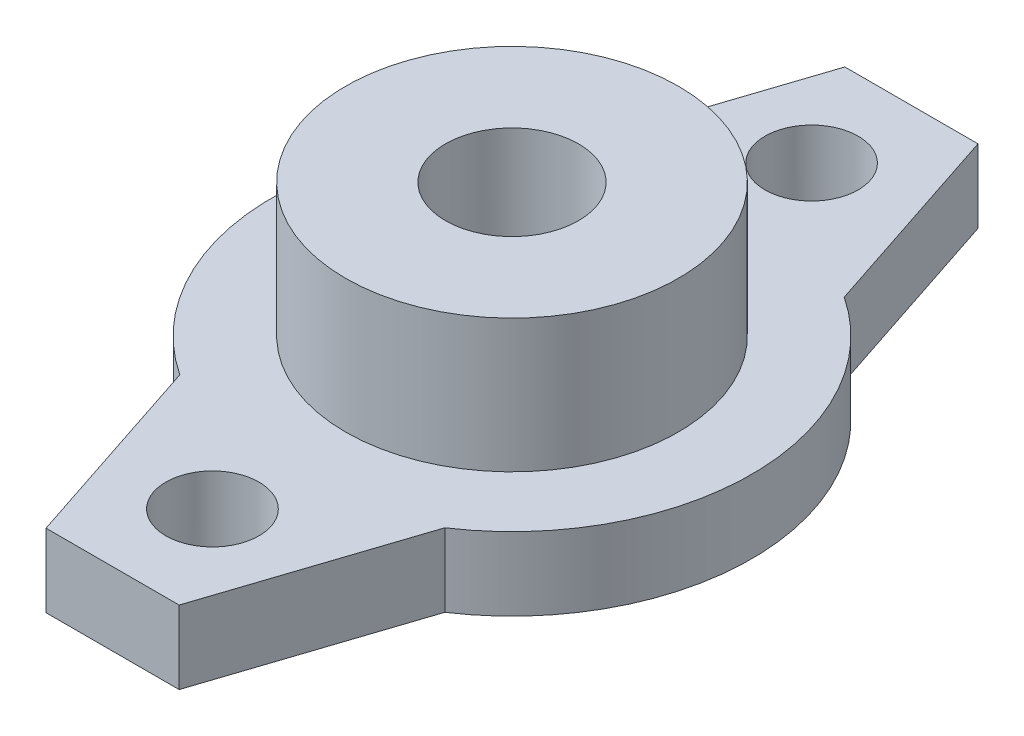
ISO-10303-21;
HEADER;
FILE_DESCRIPTION(('STEP AP214'),'2;1');
FILE_NAME('part.step','',(''),(''),'','','');
FILE_SCHEMA(('AUTOMOTIVE_DESIGN { 1 0 10303 214 1 1 1 1 }'));
ENDSEC;
DATA;
#1=APPLICATION_CONTEXT('core data for automotive mechanical design processes');
#2=APPLICATION_PROTOCOL_DEFINITION('international standard','automotive_design',2000,#1);
#3=PRODUCT_CONTEXT('',#1,'mechanical');
#4=PRODUCT('Part','Part','',(#3));
#5=PRODUCT_RELATED_PRODUCT_CATEGORY('part','',(#4));
#6=PRODUCT_DEFINITION_FORMATION('','',#4);
#7=PRODUCT_DEFINITION_CONTEXT('part definition',#1,'design');
#8=PRODUCT_DEFINITION('design','',#6,#7);
#9=PRODUCT_DEFINITION_SHAPE('','',#8);
#10=(LENGTH_UNIT() NAMED_UNIT(*) SI_UNIT(.MILLI.,.METRE.));
#11=(NAMED_UNIT(*) PLANE_ANGLE_UNIT() SI_UNIT($,.RADIAN.));
#12=(NAMED_UNIT(*) SI_UNIT($,.STERADIAN.) SOLID_ANGLE_UNIT());
#13=UNCERTAINTY_MEASURE_WITH_UNIT(LENGTH_MEASURE(1.E-05),#10,'distance_accuracy_value','');
#14=(GEOMETRIC_REPRESENTATION_CONTEXT(3) GLOBAL_UNCERTAINTY_ASSIGNED_CONTEXT((#13)) GLOBAL_UNIT_ASSIGNED_CONTEXT((#10,
#11,#12)) REPRESENTATION_CONTEXT('',''));
#15=CARTESIAN_POINT('',(0.,0.,0.));
#16=DIRECTION('',(0.,0.,1.));
#17=DIRECTION('',(1.,0.,0.));
#18=AXIS2_PLACEMENT_3D('',#15,#16,#17);
#19=CARTESIAN_POINT('',(0.,5.5,0.));
#20=DIRECTION('',(0.,-1.,0.));
#21=DIRECTION('',(0.,0.,-1.));
#22=AXIS2_PLACEMENT_3D('',#19,#20,#21);
#23=CYLINDRICAL_SURFACE('',#22,18.);
#24=CARTESIAN_POINT('',(0.,0.,0.));
#25=DIRECTION('',(0.,1.,0.));
#26=DIRECTION('',(0.,0.,-1.));
#27=AXIS2_PLACEMENT_3D('',#24,#25,#26);
#28=CIRCLE('',#27,18.);
#29=CARTESIAN_POINT('',(-9.9498743710662,0.,-15.));
#30=VERTEX_POINT('',#29);
#31=CARTESIAN_POINT('',(-9.9498743710662,0.,15.));
#32=VERTEX_POINT('',#31);
#33=EDGE_CURVE('E136',#30,#32,#28,.T.);
#34=ORIENTED_EDGE('',*,*,#33,.T.);
#35=DIRECTION('',(0.,-1.,0.));
#36=VECTOR('',#35,1.);
#37=CARTESIAN_POINT('',(-9.9498743710662,5.5,15.));
#38=LINE('',#37,#36);
#39=CARTESIAN_POINT('',(-9.9498743710662,5.5,15.));
#40=VERTEX_POINT('',#39);
#41=EDGE_CURVE('E46',#40,#32,#38,.T.);
#42=ORIENTED_EDGE('',*,*,#41,.F.);
#43=CARTESIAN_POINT('',(0.,5.5,0.));
#44=DIRECTION('',(0.,1.,0.));
#45=DIRECTION('',(0.,0.,-1.));
#46=AXIS2_PLACEMENT_3D('',#43,#44,#45);
#47=CIRCLE('',#46,18.);
#48=CARTESIAN_POINT('',(-9.9498743710662,5.5,-15.));
#49=VERTEX_POINT('',#48);
#50=EDGE_CURVE('E151',#49,#40,#47,.T.);
#51=ORIENTED_EDGE('',*,*,#50,.F.);
#52=DIRECTION('',(0.,-1.,0.));
#53=VECTOR('',#52,1.);
#54=CARTESIAN_POINT('',(-9.9498743710662,5.5,-15.));
#55=LINE('',#54,#53);
#56=EDGE_CURVE('E132',#49,#30,#55,.T.);
#57=ORIENTED_EDGE('',*,*,#56,.T.);
#58=EDGE_LOOP('',(#34,#42,#51,#57));
#59=FACE_BOUND('',#58,.T.);
#60=ADVANCED_FACE('F37',(#59),#23,.T.);
#61=CARTESIAN_POINT('',(-9.9498743710662,5.5,15.));
#62=DIRECTION('',(0.949631015948138,0.,-0.313370281854083));
#63=DIRECTION('',(-0.313370281854083,0.,-0.949631015948138));
#64=AXIS2_PLACEMENT_3D('',#61,#62,#63);
#65=PLANE('',#64);
#66=DIRECTION('',(0.313370281854083,0.,0.949631015948138));
#67=VECTOR('',#66,1.);
#68=CARTESIAN_POINT('',(-9.9498743710662,0.,15.));
#69=LINE('',#68,#67);
#70=CARTESIAN_POINT('',(-5.,0.,30.));
#71=VERTEX_POINT('',#70);
#72=EDGE_CURVE('E139',#32,#71,#69,.T.);
#73=ORIENTED_EDGE('',*,*,#72,.T.);
#74=DIRECTION('',(0.,-1.,0.));
#75=VECTOR('',#74,1.);
#76=CARTESIAN_POINT('',(-5.,5.5,30.));
#77=LINE('',#76,#75);
#78=CARTESIAN_POINT('',(-5.,5.5,30.));
#79=VERTEX_POINT('',#78);
#80=EDGE_CURVE('E161',#79,#71,#77,.T.);
#81=ORIENTED_EDGE('',*,*,#80,.F.);
#82=DIRECTION('',(0.313370281854083,0.,0.949631015948138));
#83=VECTOR('',#82,1.);
#84=CARTESIAN_POINT('',(-9.9498743710662,5.5,15.));
#85=LINE('',#84,#83);
#86=EDGE_CURVE('E99',#40,#79,#85,.T.);
#87=ORIENTED_EDGE('',*,*,#86,.F.);
#88=ORIENTED_EDGE('',*,*,#41,.T.);
#89=EDGE_LOOP('',(#73,#81,#87,#88));
#90=FACE_BOUND('',#89,.T.);
#91=ADVANCED_FACE('F220',(#90),#65,.F.);
#92=CARTESIAN_POINT('',(-5.,5.5,30.));
#93=DIRECTION('',(0.,0.,-1.));
#94=DIRECTION('',(-1.,0.,0.));
#95=AXIS2_PLACEMENT_3D('',#92,#93,#94);
#96=PLANE('',#95);
#97=DIRECTION('',(1.,0.,0.));
#98=VECTOR('',#97,1.);
#99=CARTESIAN_POINT('',(-5.,0.,30.));
#100=LINE('',#99,#98);
#101=CARTESIAN_POINT('',(5.,0.,30.));
#102=VERTEX_POINT('',#101);
#103=EDGE_CURVE('E142',#71,#102,#100,.T.);
#104=ORIENTED_EDGE('',*,*,#103,.T.);
#105=DIRECTION('',(0.,-1.,0.));
#106=VECTOR('',#105,1.);
#107=CARTESIAN_POINT('',(5.,5.5,30.));
#108=LINE('',#107,#106);
#109=CARTESIAN_POINT('',(5.,5.5,30.));
#110=VERTEX_POINT('',#109);
#111=EDGE_CURVE('E158',#110,#102,#108,.T.);
#112=ORIENTED_EDGE('',*,*,#111,.F.);
#113=DIRECTION('',(1.,0.,0.));
#114=VECTOR('',#113,1.);
#115=CARTESIAN_POINT('',(-5.,5.5,30.));
#116=LINE('',#115,#114);
#117=EDGE_CURVE('E188',#79,#110,#116,.T.);
#118=ORIENTED_EDGE('',*,*,#117,.F.);
#119=ORIENTED_EDGE('',*,*,#80,.T.);
#120=EDGE_LOOP('',(#104,#112,#118,#119));
#121=FACE_BOUND('',#120,.T.);
#122=ADVANCED_FACE('F224',(#121),#96,.F.);
#123=CARTESIAN_POINT('',(9.9498743710662,5.5,15.));
#124=DIRECTION('',(-0.949631015948138,0.,-0.313370281854083));
#125=DIRECTION('',(-0.313370281854083,0.,0.949631015948138));
#126=AXIS2_PLACEMENT_3D('',#123,#124,#125);
#127=PLANE('',#126);
#128=DIRECTION('',(0.313370281854083,0.,-0.949631015948138));
#129=VECTOR('',#128,1.);
#130=CARTESIAN_POINT('',(9.9498743710662,0.,15.));
#131=LINE('',#130,#129);
#132=CARTESIAN_POINT('',(9.9498743710662,0.,15.));
#133=VERTEX_POINT('',#132);
#134=EDGE_CURVE('E144',#102,#133,#131,.T.);
#135=ORIENTED_EDGE('',*,*,#134,.T.);
#136=DIRECTION('',(0.,-1.,0.));
#137=VECTOR('',#136,1.);
#138=CARTESIAN_POINT('',(9.9498743710662,5.5,15.));
#139=LINE('',#138,#137);
#140=CARTESIAN_POINT('',(9.9498743710662,5.5,15.));
#141=VERTEX_POINT('',#140);
#142=EDGE_CURVE('E155',#141,#133,#139,.T.);
#143=ORIENTED_EDGE('',*,*,#142,.F.);
#144=DIRECTION('',(0.313370281854083,0.,-0.949631015948138));
#145=VECTOR('',#144,1.);
#146=CARTESIAN_POINT('',(9.9498743710662,5.5,15.));
#147=LINE('',#146,#145);
#148=EDGE_CURVE('E190',#110,#141,#147,.T.);
#149=ORIENTED_EDGE('',*,*,#148,.F.);
#150=ORIENTED_EDGE('',*,*,#111,.T.);
#151=EDGE_LOOP('',(#135,#143,#149,#150));
#152=FACE_BOUND('',#151,.T.);
#153=ADVANCED_FACE('F196',(#152),#127,.F.);
#154=CARTESIAN_POINT('',(0.,5.5,0.));
#155=DIRECTION('',(0.,-1.,0.));
#156=DIRECTION('',(0.,0.,-1.));
#157=AXIS2_PLACEMENT_3D('',#154,#155,#156);
#158=CYLINDRICAL_SURFACE('',#157,18.);
#159=CARTESIAN_POINT('',(0.,0.,0.));
#160=DIRECTION('',(0.,1.,0.));
#161=DIRECTION('',(0.,0.,1.));
#162=AXIS2_PLACEMENT_3D('',#159,#160,#161);
#163=CIRCLE('',#162,18.);
#164=CARTESIAN_POINT('',(9.9498743710662,0.,-15.));
#165=VERTEX_POINT('',#164);
#166=EDGE_CURVE('E146',#133,#165,#163,.T.);
#167=ORIENTED_EDGE('',*,*,#166,.T.);
#168=DIRECTION('',(0.,-1.,0.));
#169=VECTOR('',#168,1.);
#170=CARTESIAN_POINT('',(9.9498743710662,5.5,-15.));
#171=LINE('',#170,#169);
#172=CARTESIAN_POINT('',(9.9498743710662,5.5,-15.));
#173=VERTEX_POINT('',#172);
#174=EDGE_CURVE('E127',#173,#165,#171,.T.);
#175=ORIENTED_EDGE('',*,*,#174,.F.);
#176=CARTESIAN_POINT('',(0.,5.5,0.));
#177=DIRECTION('',(0.,1.,0.));
#178=DIRECTION('',(0.,0.,1.));
#179=AXIS2_PLACEMENT_3D('',#176,#177,#178);
#180=CIRCLE('',#179,18.);
#181=EDGE_CURVE('E118',#141,#173,#180,.T.);
#182=ORIENTED_EDGE('',*,*,#181,.F.);
#183=ORIENTED_EDGE('',*,*,#142,.T.);
#184=EDGE_LOOP('',(#167,#175,#182,#183));
#185=FACE_BOUND('',#184,.T.);
#186=ADVANCED_FACE('F200',(#185),#158,.T.);
#187=CARTESIAN_POINT('',(9.9498743710662,5.5,-15.));
#188=DIRECTION('',(-0.949631015948138,0.,0.313370281854083));
#189=DIRECTION('',(0.313370281854083,0.,0.949631015948138));
#190=AXIS2_PLACEMENT_3D('',#187,#188,#189);
#191=PLANE('',#190);
#192=DIRECTION('',(-0.313370281854083,0.,-0.949631015948138));
#193=VECTOR('',#192,1.);
#194=CARTESIAN_POINT('',(9.9498743710662,0.,-15.));
#195=LINE('',#194,#193);
#196=CARTESIAN_POINT('',(5.,0.,-30.));
#197=VERTEX_POINT('',#196);
#198=EDGE_CURVE('E126',#165,#197,#195,.T.);
#199=ORIENTED_EDGE('',*,*,#198,.T.);
#200=DIRECTION('',(0.,-1.,0.));
#201=VECTOR('',#200,1.);
#202=CARTESIAN_POINT('',(5.,5.5,-30.));
#203=LINE('',#202,#201);
#204=CARTESIAN_POINT('',(5.,5.5,-30.));
#205=VERTEX_POINT('',#204);
#206=EDGE_CURVE('E123',#205,#197,#203,.T.);
#207=ORIENTED_EDGE('',*,*,#206,.F.);
#208=DIRECTION('',(-0.313370281854083,0.,-0.949631015948138));
#209=VECTOR('',#208,1.);
#210=CARTESIAN_POINT('',(9.9498743710662,5.5,-15.));
#211=LINE('',#210,#209);
#212=EDGE_CURVE('E112',#173,#205,#211,.T.);
#213=ORIENTED_EDGE('',*,*,#212,.F.);
#214=ORIENTED_EDGE('',*,*,#174,.T.);
#215=EDGE_LOOP('',(#199,#207,#213,#214));
#216=FACE_BOUND('',#215,.T.);
#217=ADVANCED_FACE('F124',(#216),#191,.F.);
#218=CARTESIAN_POINT('',(-5.,5.5,-30.));
#219=DIRECTION('',(0.,0.,1.));
#220=DIRECTION('',(1.,0.,0.));
#221=AXIS2_PLACEMENT_3D('',#218,#219,#220);
#222=PLANE('',#221);
#223=DIRECTION('',(-1.,0.,0.));
#224=VECTOR('',#223,1.);
#225=CARTESIAN_POINT('',(-5.,0.,-30.));
#226=LINE('',#225,#224);
#227=CARTESIAN_POINT('',(-5.,0.,-30.));
#228=VERTEX_POINT('',#227);
#229=EDGE_CURVE('E84',#197,#228,#226,.T.);
#230=ORIENTED_EDGE('',*,*,#229,.T.);
#231=DIRECTION('',(0.,-1.,0.));
#232=VECTOR('',#231,1.);
#233=CARTESIAN_POINT('',(-5.,5.5,-30.));
#234=LINE('',#233,#232);
#235=CARTESIAN_POINT('',(-5.,5.5,-30.));
#236=VERTEX_POINT('',#235);
#237=EDGE_CURVE('E128',#236,#228,#234,.T.);
#238=ORIENTED_EDGE('',*,*,#237,.F.);
#239=DIRECTION('',(-1.,0.,0.));
#240=VECTOR('',#239,1.);
#241=CARTESIAN_POINT('',(-5.,5.5,-30.));
#242=LINE('',#241,#240);
#243=EDGE_CURVE('E116',#205,#236,#242,.T.);
#244=ORIENTED_EDGE('',*,*,#243,.F.);
#245=ORIENTED_EDGE('',*,*,#206,.T.);
#246=EDGE_LOOP('',(#230,#238,#244,#245));
#247=FACE_BOUND('',#246,.T.);
#248=ADVANCED_FACE('F130',(#247),#222,.F.);
#249=CARTESIAN_POINT('',(-9.9498743710662,5.5,-15.));
#250=DIRECTION('',(0.949631015948138,0.,0.313370281854083));
#251=DIRECTION('',(0.313370281854083,0.,-0.949631015948138));
#252=AXIS2_PLACEMENT_3D('',#249,#250,#251);
#253=PLANE('',#252);
#254=DIRECTION('',(-0.313370281854083,0.,0.949631015948138));
#255=VECTOR('',#254,1.);
#256=CARTESIAN_POINT('',(-9.9498743710662,0.,-15.));
#257=LINE('',#256,#255);
#258=EDGE_CURVE('E90',#228,#30,#257,.T.);
#259=ORIENTED_EDGE('',*,*,#258,.T.);
#260=ORIENTED_EDGE('',*,*,#56,.F.);
#261=DIRECTION('',(-0.313370281854083,0.,0.949631015948138));
#262=VECTOR('',#261,1.);
#263=CARTESIAN_POINT('',(-9.9498743710662,5.5,-15.));
#264=LINE('',#263,#262);
#265=EDGE_CURVE('E55',#236,#49,#264,.T.);
#266=ORIENTED_EDGE('',*,*,#265,.F.);
#267=ORIENTED_EDGE('',*,*,#237,.T.);
#268=EDGE_LOOP('',(#259,#260,#266,#267));
#269=FACE_BOUND('',#268,.T.);
#270=ADVANCED_FACE('F208',(#269),#253,.F.);
#271=CARTESIAN_POINT('',(0.,5.5,0.));
#272=DIRECTION('',(0.,-1.,0.));
#273=DIRECTION('',(0.,0.,-1.));
#274=AXIS2_PLACEMENT_3D('',#271,#272,#273);
#275=PLANE('',#274);
#276=CARTESIAN_POINT('',(0.,5.5,-22.5));
#277=DIRECTION('',(0.,1.,0.));
#278=DIRECTION('',(0.,0.,1.));
#279=AXIS2_PLACEMENT_3D('',#276,#277,#278);
#280=CIRCLE('',#279,3.5);
#281=CARTESIAN_POINT('',(0.,5.5,-19.));
#282=VERTEX_POINT('',#281);
#283=EDGE_CURVE('E170',#282,#282,#280,.T.);
#284=ORIENTED_EDGE('',*,*,#283,.F.);
#285=EDGE_LOOP('',(#284));
#286=FACE_BOUND('',#285,.T.);
#287=CARTESIAN_POINT('',(0.,5.5,22.5));
#288=DIRECTION('',(0.,1.,0.));
#289=DIRECTION('',(0.,0.,1.));
#290=AXIS2_PLACEMENT_3D('',#287,#288,#289);
#291=CIRCLE('',#290,3.5);
#292=CARTESIAN_POINT('',(0.,5.5,26.));
#293=VERTEX_POINT('',#292);
#294=EDGE_CURVE('E175',#293,#293,#291,.T.);
#295=ORIENTED_EDGE('',*,*,#294,.F.);
#296=EDGE_LOOP('',(#295));
#297=FACE_BOUND('',#296,.T.);
#298=CARTESIAN_POINT('',(0.,5.5,0.));
#299=DIRECTION('',(0.,-1.,0.));
#300=DIRECTION('',(0.,0.,-1.));
#301=AXIS2_PLACEMENT_3D('',#298,#299,#300);
#302=CIRCLE('',#301,12.5);
#303=CARTESIAN_POINT('',(0.,5.5,-12.5));
#304=VERTEX_POINT('',#303);
#305=EDGE_CURVE('E11',#304,#304,#302,.F.);
#306=ORIENTED_EDGE('',*,*,#305,.F.);
#307=EDGE_LOOP('',(#306));
#308=FACE_BOUND('',#307,.T.);
#309=ORIENTED_EDGE('',*,*,#50,.T.);
#310=ORIENTED_EDGE('',*,*,#86,.T.);
#311=ORIENTED_EDGE('',*,*,#117,.T.);
#312=ORIENTED_EDGE('',*,*,#148,.T.);
#313=ORIENTED_EDGE('',*,*,#181,.T.);
#314=ORIENTED_EDGE('',*,*,#212,.T.);
#315=ORIENTED_EDGE('',*,*,#243,.T.);
#316=ORIENTED_EDGE('',*,*,#265,.T.);
#317=EDGE_LOOP('',(#309,#310,#311,#312,#313,#314,#315,#316));
#318=FACE_BOUND('',#317,.T.);
#319=ADVANCED_FACE('F114',(#286,#297,#308,#318),#275,.F.);
#320=CARTESIAN_POINT('',(0.,0.,0.));
#321=DIRECTION('',(0.,-1.,0.));
#322=DIRECTION('',(0.,0.,-1.));
#323=AXIS2_PLACEMENT_3D('',#320,#321,#322);
#324=PLANE('',#323);
#325=CARTESIAN_POINT('',(0.,0.,-22.5));
#326=DIRECTION('',(0.,-1.,0.));
#327=DIRECTION('',(0.,0.,-1.));
#328=AXIS2_PLACEMENT_3D('',#325,#326,#327);
#329=CIRCLE('',#328,3.5);
#330=CARTESIAN_POINT('',(0.,0.,-26.));
#331=VERTEX_POINT('',#330);
#332=EDGE_CURVE('E40',#331,#331,#329,.T.);
#333=ORIENTED_EDGE('',*,*,#332,.F.);
#334=EDGE_LOOP('',(#333));
#335=FACE_BOUND('',#334,.T.);
#336=CARTESIAN_POINT('',(0.,0.,22.5));
#337=DIRECTION('',(0.,-1.,0.));
#338=DIRECTION('',(0.,0.,-1.));
#339=AXIS2_PLACEMENT_3D('',#336,#337,#338);
#340=CIRCLE('',#339,3.5);
#341=CARTESIAN_POINT('',(0.,0.,19.));
#342=VERTEX_POINT('',#341);
#343=EDGE_CURVE('E168',#342,#342,#340,.T.);
#344=ORIENTED_EDGE('',*,*,#343,.F.);
#345=EDGE_LOOP('',(#344));
#346=FACE_BOUND('',#345,.T.);
#347=CARTESIAN_POINT('',(0.,0.,0.));
#348=DIRECTION('',(0.,-1.,0.));
#349=DIRECTION('',(0.,0.,-1.));
#350=AXIS2_PLACEMENT_3D('',#347,#348,#349);
#351=CIRCLE('',#350,5.);
#352=CARTESIAN_POINT('',(0.,0.,-5.));
#353=VERTEX_POINT('',#352);
#354=EDGE_CURVE('E165',#353,#353,#351,.T.);
#355=ORIENTED_EDGE('',*,*,#354,.F.);
#356=EDGE_LOOP('',(#355));
#357=FACE_BOUND('',#356,.T.);
#358=ORIENTED_EDGE('',*,*,#33,.F.);
#359=ORIENTED_EDGE('',*,*,#258,.F.);
#360=ORIENTED_EDGE('',*,*,#229,.F.);
#361=ORIENTED_EDGE('',*,*,#198,.F.);
#362=ORIENTED_EDGE('',*,*,#166,.F.);
#363=ORIENTED_EDGE('',*,*,#134,.F.);
#364=ORIENTED_EDGE('',*,*,#103,.F.);
#365=ORIENTED_EDGE('',*,*,#72,.F.);
#366=EDGE_LOOP('',(#358,#359,#360,#361,#362,#363,#364,#365));
#367=FACE_BOUND('',#366,.T.);
#368=ADVANCED_FACE('F203',(#335,#346,#357,#367),#324,.T.);
#369=CARTESIAN_POINT('',(0.,15.5,0.));
#370=DIRECTION('',(0.,1.,0.));
#371=DIRECTION('',(0.,0.,1.));
#372=AXIS2_PLACEMENT_3D('',#369,#370,#371);
#373=PLANE('',#372);
#374=CARTESIAN_POINT('',(0.,15.5,0.));
#375=DIRECTION('',(0.,1.,0.));
#376=DIRECTION('',(0.,0.,1.));
#377=AXIS2_PLACEMENT_3D('',#374,#375,#376);
#378=CIRCLE('',#377,12.5);
#379=CARTESIAN_POINT('',(0.,15.5,12.5));
#380=VERTEX_POINT('',#379);
#381=EDGE_CURVE('E140',#380,#380,#378,.T.);
#382=ORIENTED_EDGE('',*,*,#381,.T.);
#383=EDGE_LOOP('',(#382));
#384=FACE_BOUND('',#383,.T.);
#385=CARTESIAN_POINT('',(0.,15.5,0.));
#386=DIRECTION('',(0.,1.,0.));
#387=DIRECTION('',(0.,0.,1.));
#388=AXIS2_PLACEMENT_3D('',#385,#386,#387);
#389=CIRCLE('',#388,5.);
#390=CARTESIAN_POINT('',(0.,15.5,5.));
#391=VERTEX_POINT('',#390);
#392=EDGE_CURVE('E167',#391,#391,#389,.T.);
#393=ORIENTED_EDGE('',*,*,#392,.F.);
#394=EDGE_LOOP('',(#393));
#395=FACE_BOUND('',#394,.T.);
#396=ADVANCED_FACE('F256',(#384,#395),#373,.T.);
#397=CARTESIAN_POINT('',(0.,15.5,0.));
#398=DIRECTION('',(0.,-1.,0.));
#399=DIRECTION('',(0.,0.,-1.));
#400=AXIS2_PLACEMENT_3D('',#397,#398,#399);
#401=CYLINDRICAL_SURFACE('',#400,12.5);
#402=ORIENTED_EDGE('',*,*,#381,.F.);
#403=EDGE_LOOP('',(#402));
#404=FACE_BOUND('',#403,.T.);
#405=ORIENTED_EDGE('',*,*,#305,.T.);
#406=EDGE_LOOP('',(#405));
#407=FACE_BOUND('',#406,.T.);
#408=ADVANCED_FACE('F261',(#404,#407),#401,.T.);
#409=CARTESIAN_POINT('',(0.,15.5,0.));
#410=DIRECTION('',(0.,-1.,0.));
#411=DIRECTION('',(0.,0.,-1.));
#412=AXIS2_PLACEMENT_3D('',#409,#410,#411);
#413=CYLINDRICAL_SURFACE('',#412,5.);
#414=ORIENTED_EDGE('',*,*,#392,.T.);
#415=EDGE_LOOP('',(#414));
#416=FACE_BOUND('',#415,.T.);
#417=ORIENTED_EDGE('',*,*,#354,.T.);
#418=EDGE_LOOP('',(#417));
#419=FACE_BOUND('',#418,.T.);
#420=ADVANCED_FACE('F274',(#416,#419),#413,.F.);
#421=CARTESIAN_POINT('',(0.,-4.5,22.5));
#422=DIRECTION('',(0.,1.,0.));
#423=DIRECTION('',(0.,0.,1.));
#424=AXIS2_PLACEMENT_3D('',#421,#422,#423);
#425=CYLINDRICAL_SURFACE('',#424,3.5);
#426=ORIENTED_EDGE('',*,*,#343,.T.);
#427=EDGE_LOOP('',(#426));
#428=FACE_BOUND('',#427,.T.);
#429=ORIENTED_EDGE('',*,*,#294,.T.);
#430=EDGE_LOOP('',(#429));
#431=FACE_BOUND('',#430,.T.);
#432=ADVANCED_FACE('F286',(#428,#431),#425,.F.);
#433=CARTESIAN_POINT('',(0.,-4.5,-22.5));
#434=DIRECTION('',(0.,1.,0.));
#435=DIRECTION('',(0.,0.,1.));
#436=AXIS2_PLACEMENT_3D('',#433,#434,#435);
#437=CYLINDRICAL_SURFACE('',#436,3.5);
#438=ORIENTED_EDGE('',*,*,#332,.T.);
#439=EDGE_LOOP('',(#438));
#440=FACE_BOUND('',#439,.T.);
#441=ORIENTED_EDGE('',*,*,#283,.T.);
#442=EDGE_LOOP('',(#441));
#443=FACE_BOUND('',#442,.T.);
#444=ADVANCED_FACE('F309',(#440,#443),#437,.F.);
#445=CLOSED_SHELL('',(#60,#91,#122,#153,#186,#217,#248,#270,#319,#368,#396,#408,#420,#432,#444));
#446=MANIFOLD_SOLID_BREP('B2',#445);
#447=ADVANCED_BREP_SHAPE_REPRESENTATION('',(#18,#446),#14);
#448=SHAPE_DEFINITION_REPRESENTATION(#9,#447);
ENDSEC;
END-ISO-10303-21;
